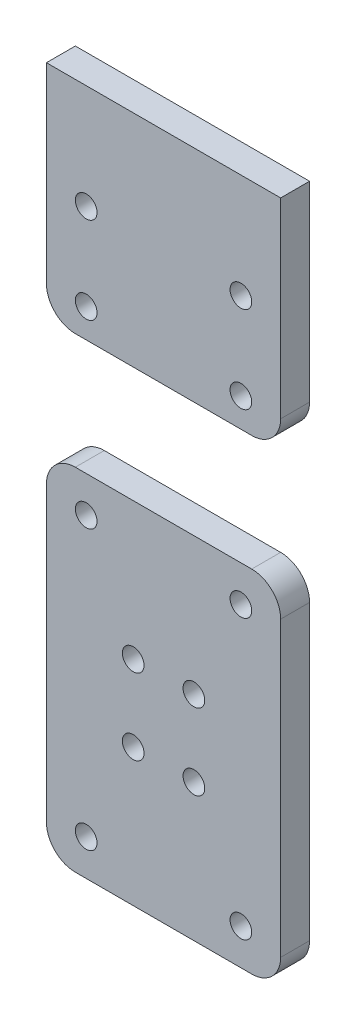
ISO-10303-21;
HEADER;
FILE_DESCRIPTION(('STEP AP214'),'2;1');
FILE_NAME('part.step','',(''),(''),'','','');
FILE_SCHEMA(('AUTOMOTIVE_DESIGN { 1 0 10303 214 1 1 1 1 }'));
ENDSEC;
DATA;
#1=APPLICATION_CONTEXT('core data for automotive mechanical design processes');
#2=APPLICATION_PROTOCOL_DEFINITION('international standard','automotive_design',2000,#1);
#3=PRODUCT_CONTEXT('',#1,'mechanical');
#4=PRODUCT('Part','Part','',(#3));
#5=PRODUCT_RELATED_PRODUCT_CATEGORY('part','',(#4));
#6=PRODUCT_DEFINITION_FORMATION('','',#4);
#7=PRODUCT_DEFINITION_CONTEXT('part definition',#1,'design');
#8=PRODUCT_DEFINITION('design','',#6,#7);
#9=PRODUCT_DEFINITION_SHAPE('','',#8);
#10=(LENGTH_UNIT() NAMED_UNIT(*) SI_UNIT(.MILLI.,.METRE.));
#11=(NAMED_UNIT(*) PLANE_ANGLE_UNIT() SI_UNIT($,.RADIAN.));
#12=(NAMED_UNIT(*) SI_UNIT($,.STERADIAN.) SOLID_ANGLE_UNIT());
#13=UNCERTAINTY_MEASURE_WITH_UNIT(LENGTH_MEASURE(1.E-05),#10,'distance_accuracy_value','');
#14=(GEOMETRIC_REPRESENTATION_CONTEXT(3) GLOBAL_UNCERTAINTY_ASSIGNED_CONTEXT((#13)) GLOBAL_UNIT_ASSIGNED_CONTEXT((#10,
#11,#12)) REPRESENTATION_CONTEXT('',''));
#15=CARTESIAN_POINT('',(0.,0.,0.));
#16=DIRECTION('',(0.,0.,1.));
#17=DIRECTION('',(1.,0.,0.));
#18=AXIS2_PLACEMENT_3D('',#15,#16,#17);
#19=CARTESIAN_POINT('',(2.00000000000013,54.7,2.));
#20=DIRECTION('',(0.,0.,1.));
#21=DIRECTION('',(1.,0.,0.));
#22=AXIS2_PLACEMENT_3D('',#19,#20,#21);
#23=PLANE('',#22);
#24=CARTESIAN_POINT('',(2.00000000000013,54.7,2.));
#25=DIRECTION('',(0.,0.,1.));
#26=DIRECTION('',(1.,0.,0.));
#27=AXIS2_PLACEMENT_3D('',#24,#25,#26);
#28=CIRCLE('',#27,2.00000000000002);
#29=CARTESIAN_POINT('',(1.11022302462516E-13,54.7,2.));
#30=VERTEX_POINT('',#29);
#31=CARTESIAN_POINT('',(2.00000000000013,52.7,2.));
#32=VERTEX_POINT('',#31);
#33=EDGE_CURVE('E100',#30,#32,#28,.T.);
#34=ORIENTED_EDGE('',*,*,#33,.T.);
#35=DIRECTION('',(1.,0.,0.));
#36=VECTOR('',#35,1.);
#37=CARTESIAN_POINT('',(14.1999999999999,52.7,2.));
#38=LINE('',#37,#36);
#39=CARTESIAN_POINT('',(14.1999999999999,52.7,2.));
#40=VERTEX_POINT('',#39);
#41=EDGE_CURVE('E96',#32,#40,#38,.T.);
#42=ORIENTED_EDGE('',*,*,#41,.T.);
#43=CARTESIAN_POINT('',(14.1999999999999,54.7,2.));
#44=DIRECTION('',(0.,0.,1.));
#45=DIRECTION('',(-1.,0.,0.));
#46=AXIS2_PLACEMENT_3D('',#43,#44,#45);
#47=CIRCLE('',#46,2.00000000000001);
#48=CARTESIAN_POINT('',(16.1999999999999,54.7,2.));
#49=VERTEX_POINT('',#48);
#50=EDGE_CURVE('E93',#40,#49,#47,.T.);
#51=ORIENTED_EDGE('',*,*,#50,.T.);
#52=DIRECTION('',(0.,1.,0.));
#53=VECTOR('',#52,1.);
#54=CARTESIAN_POINT('',(16.1999999999999,54.7,2.));
#55=LINE('',#54,#53);
#56=CARTESIAN_POINT('',(16.1999999999999,67.93,2.));
#57=VERTEX_POINT('',#56);
#58=EDGE_CURVE('E116',#49,#57,#55,.T.);
#59=ORIENTED_EDGE('',*,*,#58,.T.);
#60=DIRECTION('',(-1.,0.,0.));
#61=VECTOR('',#60,1.);
#62=CARTESIAN_POINT('',(1.03649727689614E-13,67.93,2.));
#63=LINE('',#62,#61);
#64=CARTESIAN_POINT('',(1.03649727689614E-13,67.93,2.));
#65=VERTEX_POINT('',#64);
#66=EDGE_CURVE('E118',#57,#65,#63,.T.);
#67=ORIENTED_EDGE('',*,*,#66,.T.);
#68=DIRECTION('',(0.,-1.,0.));
#69=VECTOR('',#68,1.);
#70=CARTESIAN_POINT('',(1.11022302462516E-13,54.7,2.));
#71=LINE('',#70,#69);
#72=EDGE_CURVE('E144',#65,#30,#71,.T.);
#73=ORIENTED_EDGE('',*,*,#72,.T.);
#74=EDGE_LOOP('',(#34,#42,#51,#59,#67,#73));
#75=FACE_BOUND('',#74,.T.);
#76=CARTESIAN_POINT('',(2.74999999998533,54.7,2.));
#77=DIRECTION('',(0.,0.,1.));
#78=DIRECTION('',(1.,0.,0.));
#79=AXIS2_PLACEMENT_3D('',#76,#77,#78);
#80=CIRCLE('',#79,0.749999999999999);
#81=CARTESIAN_POINT('',(3.49999999998533,54.7,2.));
#82=VERTEX_POINT('',#81);
#83=EDGE_CURVE('E12',#82,#82,#80,.T.);
#84=ORIENTED_EDGE('',*,*,#83,.F.);
#85=EDGE_LOOP('',(#84));
#86=FACE_BOUND('',#85,.T.);
#87=CARTESIAN_POINT('',(13.4500000000147,60.7,2.));
#88=DIRECTION('',(0.,0.,1.));
#89=DIRECTION('',(-1.,0.,0.));
#90=AXIS2_PLACEMENT_3D('',#87,#88,#89);
#91=CIRCLE('',#90,0.75);
#92=CARTESIAN_POINT('',(12.7000000000147,60.7,2.));
#93=VERTEX_POINT('',#92);
#94=EDGE_CURVE('E53',#93,#93,#91,.T.);
#95=ORIENTED_EDGE('',*,*,#94,.F.);
#96=EDGE_LOOP('',(#95));
#97=FACE_BOUND('',#96,.T.);
#98=CARTESIAN_POINT('',(13.4500000000147,54.7,2.));
#99=DIRECTION('',(0.,0.,1.));
#100=DIRECTION('',(-1.,0.,0.));
#101=AXIS2_PLACEMENT_3D('',#98,#99,#100);
#102=CIRCLE('',#101,0.749999999999999);
#103=CARTESIAN_POINT('',(12.7000000000147,54.7,2.));
#104=VERTEX_POINT('',#103);
#105=EDGE_CURVE('E129',#104,#104,#102,.T.);
#106=ORIENTED_EDGE('',*,*,#105,.F.);
#107=EDGE_LOOP('',(#106));
#108=FACE_BOUND('',#107,.T.);
#109=CARTESIAN_POINT('',(2.74999999998533,60.7,2.));
#110=DIRECTION('',(0.,0.,1.));
#111=DIRECTION('',(1.,0.,0.));
#112=AXIS2_PLACEMENT_3D('',#109,#110,#111);
#113=CIRCLE('',#112,0.750000000000001);
#114=CARTESIAN_POINT('',(3.49999999998533,60.7,2.));
#115=VERTEX_POINT('',#114);
#116=EDGE_CURVE('E126',#115,#115,#113,.T.);
#117=ORIENTED_EDGE('',*,*,#116,.F.);
#118=EDGE_LOOP('',(#117));
#119=FACE_BOUND('',#118,.T.);
#120=ADVANCED_FACE('F45',(#75,#86,#97,#108,#119),#23,.T.);
#121=CARTESIAN_POINT('',(2.00000000000013,54.7,0.));
#122=DIRECTION('',(0.,0.,1.));
#123=DIRECTION('',(1.,0.,0.));
#124=AXIS2_PLACEMENT_3D('',#121,#122,#123);
#125=PLANE('',#124);
#126=CARTESIAN_POINT('',(2.74999999998533,54.7,0.));
#127=DIRECTION('',(0.,0.,1.));
#128=DIRECTION('',(1.,0.,0.));
#129=AXIS2_PLACEMENT_3D('',#126,#127,#128);
#130=CIRCLE('',#129,0.749999999999999);
#131=CARTESIAN_POINT('',(3.49999999998533,54.7,0.));
#132=VERTEX_POINT('',#131);
#133=EDGE_CURVE('E139',#132,#132,#130,.T.);
#134=ORIENTED_EDGE('',*,*,#133,.T.);
#135=EDGE_LOOP('',(#134));
#136=FACE_BOUND('',#135,.T.);
#137=CARTESIAN_POINT('',(13.4500000000147,60.7,0.));
#138=DIRECTION('',(0.,0.,1.));
#139=DIRECTION('',(-1.,0.,0.));
#140=AXIS2_PLACEMENT_3D('',#137,#138,#139);
#141=CIRCLE('',#140,0.75);
#142=CARTESIAN_POINT('',(12.7000000000147,60.7,0.));
#143=VERTEX_POINT('',#142);
#144=EDGE_CURVE('E134',#143,#143,#141,.T.);
#145=ORIENTED_EDGE('',*,*,#144,.T.);
#146=EDGE_LOOP('',(#145));
#147=FACE_BOUND('',#146,.T.);
#148=CARTESIAN_POINT('',(13.4500000000147,54.7,0.));
#149=DIRECTION('',(0.,0.,1.));
#150=DIRECTION('',(-1.,0.,0.));
#151=AXIS2_PLACEMENT_3D('',#148,#149,#150);
#152=CIRCLE('',#151,0.749999999999999);
#153=CARTESIAN_POINT('',(12.7000000000147,54.7,0.));
#154=VERTEX_POINT('',#153);
#155=EDGE_CURVE('E125',#154,#154,#152,.T.);
#156=ORIENTED_EDGE('',*,*,#155,.T.);
#157=EDGE_LOOP('',(#156));
#158=FACE_BOUND('',#157,.T.);
#159=CARTESIAN_POINT('',(2.74999999998533,60.7,0.));
#160=DIRECTION('',(0.,0.,1.));
#161=DIRECTION('',(1.,0.,0.));
#162=AXIS2_PLACEMENT_3D('',#159,#160,#161);
#163=CIRCLE('',#162,0.750000000000001);
#164=CARTESIAN_POINT('',(3.49999999998533,60.7,0.));
#165=VERTEX_POINT('',#164);
#166=EDGE_CURVE('E122',#165,#165,#163,.T.);
#167=ORIENTED_EDGE('',*,*,#166,.T.);
#168=EDGE_LOOP('',(#167));
#169=FACE_BOUND('',#168,.T.);
#170=CARTESIAN_POINT('',(14.1999999999999,54.7,0.));
#171=DIRECTION('',(0.,0.,1.));
#172=DIRECTION('',(-1.,0.,0.));
#173=AXIS2_PLACEMENT_3D('',#170,#171,#172);
#174=CIRCLE('',#173,2.00000000000001);
#175=CARTESIAN_POINT('',(14.1999999999999,52.7,0.));
#176=VERTEX_POINT('',#175);
#177=CARTESIAN_POINT('',(16.1999999999999,54.7,0.));
#178=VERTEX_POINT('',#177);
#179=EDGE_CURVE('E110',#176,#178,#174,.T.);
#180=ORIENTED_EDGE('',*,*,#179,.F.);
#181=DIRECTION('',(-1.,0.,0.));
#182=VECTOR('',#181,1.);
#183=CARTESIAN_POINT('',(6.,52.7,0.));
#184=LINE('',#183,#182);
#185=CARTESIAN_POINT('',(2.00000000000013,52.7,0.));
#186=VERTEX_POINT('',#185);
#187=EDGE_CURVE('E61',#176,#186,#184,.T.);
#188=ORIENTED_EDGE('',*,*,#187,.T.);
#189=CARTESIAN_POINT('',(2.00000000000013,54.7,0.));
#190=DIRECTION('',(0.,0.,1.));
#191=DIRECTION('',(1.,0.,0.));
#192=AXIS2_PLACEMENT_3D('',#189,#190,#191);
#193=CIRCLE('',#192,2.00000000000002);
#194=CARTESIAN_POINT('',(1.11022302462516E-13,54.7,0.));
#195=VERTEX_POINT('',#194);
#196=EDGE_CURVE('E163',#195,#186,#193,.T.);
#197=ORIENTED_EDGE('',*,*,#196,.F.);
#198=DIRECTION('',(0.,-1.,0.));
#199=VECTOR('',#198,1.);
#200=CARTESIAN_POINT('',(1.11022302462516E-13,54.7,0.));
#201=LINE('',#200,#199);
#202=CARTESIAN_POINT('',(1.03649727689614E-13,67.93,0.));
#203=VERTEX_POINT('',#202);
#204=EDGE_CURVE('E164',#203,#195,#201,.T.);
#205=ORIENTED_EDGE('',*,*,#204,.F.);
#206=DIRECTION('',(-1.,0.,0.));
#207=VECTOR('',#206,1.);
#208=CARTESIAN_POINT('',(1.03649727689614E-13,67.93,0.));
#209=LINE('',#208,#207);
#210=CARTESIAN_POINT('',(16.1999999999999,67.93,0.));
#211=VERTEX_POINT('',#210);
#212=EDGE_CURVE('E160',#211,#203,#209,.T.);
#213=ORIENTED_EDGE('',*,*,#212,.F.);
#214=DIRECTION('',(0.,1.,0.));
#215=VECTOR('',#214,1.);
#216=CARTESIAN_POINT('',(16.1999999999999,54.7,0.));
#217=LINE('',#216,#215);
#218=EDGE_CURVE('E109',#178,#211,#217,.T.);
#219=ORIENTED_EDGE('',*,*,#218,.F.);
#220=EDGE_LOOP('',(#180,#188,#197,#205,#213,#219));
#221=FACE_BOUND('',#220,.T.);
#222=ADVANCED_FACE('F181',(#136,#147,#158,#169,#221),#125,.F.);
#223=CARTESIAN_POINT('',(14.1999999999999,52.7,2.));
#224=DIRECTION('',(0.,1.,0.));
#225=DIRECTION('',(0.,0.,1.));
#226=AXIS2_PLACEMENT_3D('',#223,#224,#225);
#227=PLANE('',#226);
#228=ORIENTED_EDGE('',*,*,#187,.F.);
#229=DIRECTION('',(0.,0.,-1.));
#230=VECTOR('',#229,1.);
#231=CARTESIAN_POINT('',(14.1999999999999,52.7,2.));
#232=LINE('',#231,#230);
#233=EDGE_CURVE('E106',#40,#176,#232,.T.);
#234=ORIENTED_EDGE('',*,*,#233,.F.);
#235=ORIENTED_EDGE('',*,*,#41,.F.);
#236=DIRECTION('',(0.,0.,-1.));
#237=VECTOR('',#236,1.);
#238=CARTESIAN_POINT('',(2.00000000000013,52.7,2.));
#239=LINE('',#238,#237);
#240=EDGE_CURVE('E130',#32,#186,#239,.T.);
#241=ORIENTED_EDGE('',*,*,#240,.T.);
#242=EDGE_LOOP('',(#228,#234,#235,#241));
#243=FACE_BOUND('',#242,.T.);
#244=ADVANCED_FACE('F107',(#243),#227,.F.);
#245=CARTESIAN_POINT('',(14.1999999999999,54.7,2.));
#246=DIRECTION('',(0.,0.,-1.));
#247=DIRECTION('',(-1.,0.,0.));
#248=AXIS2_PLACEMENT_3D('',#245,#246,#247);
#249=CYLINDRICAL_SURFACE('',#248,2.00000000000001);
#250=ORIENTED_EDGE('',*,*,#179,.T.);
#251=DIRECTION('',(0.,0.,-1.));
#252=VECTOR('',#251,1.);
#253=CARTESIAN_POINT('',(16.1999999999999,54.7,2.));
#254=LINE('',#253,#252);
#255=EDGE_CURVE('E114',#49,#178,#254,.T.);
#256=ORIENTED_EDGE('',*,*,#255,.F.);
#257=ORIENTED_EDGE('',*,*,#50,.F.);
#258=ORIENTED_EDGE('',*,*,#233,.T.);
#259=EDGE_LOOP('',(#250,#256,#257,#258));
#260=FACE_BOUND('',#259,.T.);
#261=ADVANCED_FACE('F112',(#260),#249,.T.);
#262=CARTESIAN_POINT('',(16.1999999999999,54.7,2.));
#263=DIRECTION('',(-1.,0.,0.));
#264=DIRECTION('',(0.,0.,1.));
#265=AXIS2_PLACEMENT_3D('',#262,#263,#264);
#266=PLANE('',#265);
#267=ORIENTED_EDGE('',*,*,#218,.T.);
#268=DIRECTION('',(0.,0.,-1.));
#269=VECTOR('',#268,1.);
#270=CARTESIAN_POINT('',(16.1999999999999,67.93,2.));
#271=LINE('',#270,#269);
#272=EDGE_CURVE('E176',#57,#211,#271,.T.);
#273=ORIENTED_EDGE('',*,*,#272,.F.);
#274=ORIENTED_EDGE('',*,*,#58,.F.);
#275=ORIENTED_EDGE('',*,*,#255,.T.);
#276=EDGE_LOOP('',(#267,#273,#274,#275));
#277=FACE_BOUND('',#276,.T.);
#278=ADVANCED_FACE('F212',(#277),#266,.F.);
#279=CARTESIAN_POINT('',(1.03649727689614E-13,67.93,2.));
#280=DIRECTION('',(0.,-1.,0.));
#281=DIRECTION('',(0.,0.,-1.));
#282=AXIS2_PLACEMENT_3D('',#279,#280,#281);
#283=PLANE('',#282);
#284=ORIENTED_EDGE('',*,*,#212,.T.);
#285=DIRECTION('',(0.,0.,-1.));
#286=VECTOR('',#285,1.);
#287=CARTESIAN_POINT('',(1.03649727689614E-13,67.93,2.));
#288=LINE('',#287,#286);
#289=EDGE_CURVE('E157',#65,#203,#288,.T.);
#290=ORIENTED_EDGE('',*,*,#289,.F.);
#291=ORIENTED_EDGE('',*,*,#66,.F.);
#292=ORIENTED_EDGE('',*,*,#272,.T.);
#293=EDGE_LOOP('',(#284,#290,#291,#292));
#294=FACE_BOUND('',#293,.T.);
#295=ADVANCED_FACE('F158',(#294),#283,.F.);
#296=CARTESIAN_POINT('',(1.11022302462516E-13,54.7,2.));
#297=DIRECTION('',(1.,0.,0.));
#298=DIRECTION('',(0.,1.,0.));
#299=AXIS2_PLACEMENT_3D('',#296,#297,#298);
#300=PLANE('',#299);
#301=ORIENTED_EDGE('',*,*,#204,.T.);
#302=DIRECTION('',(0.,0.,-1.));
#303=VECTOR('',#302,1.);
#304=CARTESIAN_POINT('',(1.11022302462516E-13,54.7,2.));
#305=LINE('',#304,#303);
#306=EDGE_CURVE('E168',#30,#195,#305,.T.);
#307=ORIENTED_EDGE('',*,*,#306,.F.);
#308=ORIENTED_EDGE('',*,*,#72,.F.);
#309=ORIENTED_EDGE('',*,*,#289,.T.);
#310=EDGE_LOOP('',(#301,#307,#308,#309));
#311=FACE_BOUND('',#310,.T.);
#312=ADVANCED_FACE('F166',(#311),#300,.F.);
#313=CARTESIAN_POINT('',(2.00000000000013,54.7,2.));
#314=DIRECTION('',(0.,0.,-1.));
#315=DIRECTION('',(-1.,0.,0.));
#316=AXIS2_PLACEMENT_3D('',#313,#314,#315);
#317=CYLINDRICAL_SURFACE('',#316,2.00000000000002);
#318=ORIENTED_EDGE('',*,*,#196,.T.);
#319=ORIENTED_EDGE('',*,*,#240,.F.);
#320=ORIENTED_EDGE('',*,*,#33,.F.);
#321=ORIENTED_EDGE('',*,*,#306,.T.);
#322=EDGE_LOOP('',(#318,#319,#320,#321));
#323=FACE_BOUND('',#322,.T.);
#324=ADVANCED_FACE('F171',(#323),#317,.T.);
#325=CARTESIAN_POINT('',(2.74999999998533,60.7,2.));
#326=DIRECTION('',(0.,0.,-1.));
#327=DIRECTION('',(-1.,0.,0.));
#328=AXIS2_PLACEMENT_3D('',#325,#326,#327);
#329=CYLINDRICAL_SURFACE('',#328,0.750000000000001);
#330=ORIENTED_EDGE('',*,*,#116,.T.);
#331=EDGE_LOOP('',(#330));
#332=FACE_BOUND('',#331,.T.);
#333=ORIENTED_EDGE('',*,*,#166,.F.);
#334=EDGE_LOOP('',(#333));
#335=FACE_BOUND('',#334,.T.);
#336=ADVANCED_FACE('F201',(#332,#335),#329,.F.);
#337=CARTESIAN_POINT('',(13.4500000000147,54.7,2.));
#338=DIRECTION('',(0.,0.,-1.));
#339=DIRECTION('',(-1.,0.,0.));
#340=AXIS2_PLACEMENT_3D('',#337,#338,#339);
#341=CYLINDRICAL_SURFACE('',#340,0.749999999999999);
#342=ORIENTED_EDGE('',*,*,#105,.T.);
#343=EDGE_LOOP('',(#342));
#344=FACE_BOUND('',#343,.T.);
#345=ORIENTED_EDGE('',*,*,#155,.F.);
#346=EDGE_LOOP('',(#345));
#347=FACE_BOUND('',#346,.T.);
#348=ADVANCED_FACE('F197',(#344,#347),#341,.F.);
#349=CARTESIAN_POINT('',(13.4500000000147,60.7,2.));
#350=DIRECTION('',(0.,0.,-1.));
#351=DIRECTION('',(-1.,0.,0.));
#352=AXIS2_PLACEMENT_3D('',#349,#350,#351);
#353=CYLINDRICAL_SURFACE('',#352,0.75);
#354=ORIENTED_EDGE('',*,*,#94,.T.);
#355=EDGE_LOOP('',(#354));
#356=FACE_BOUND('',#355,.T.);
#357=ORIENTED_EDGE('',*,*,#144,.F.);
#358=EDGE_LOOP('',(#357));
#359=FACE_BOUND('',#358,.T.);
#360=ADVANCED_FACE('F193',(#356,#359),#353,.F.);
#361=CARTESIAN_POINT('',(2.74999999998533,54.7,2.));
#362=DIRECTION('',(0.,0.,-1.));
#363=DIRECTION('',(-1.,0.,0.));
#364=AXIS2_PLACEMENT_3D('',#361,#362,#363);
#365=CYLINDRICAL_SURFACE('',#364,0.749999999999999);
#366=ORIENTED_EDGE('',*,*,#83,.T.);
#367=EDGE_LOOP('',(#366));
#368=FACE_BOUND('',#367,.T.);
#369=ORIENTED_EDGE('',*,*,#133,.F.);
#370=EDGE_LOOP('',(#369));
#371=FACE_BOUND('',#370,.T.);
#372=ADVANCED_FACE('F190',(#368,#371),#365,.F.);
#373=CLOSED_SHELL('',(#120,#222,#244,#261,#278,#295,#312,#324,#336,#348,#360,#372));
#374=MANIFOLD_SOLID_BREP('B2',#373);
#375=CARTESIAN_POINT('',(2.74999999998475,22.9400000000004,2.));
#376=DIRECTION('',(0.,0.,-1.));
#377=DIRECTION('',(-1.,0.,0.));
#378=AXIS2_PLACEMENT_3D('',#375,#376,#377);
#379=CYLINDRICAL_SURFACE('',#378,0.750000000000001);
#380=CARTESIAN_POINT('',(2.74999999998475,22.9400000000004,2.));
#381=DIRECTION('',(0.,0.,1.));
#382=DIRECTION('',(1.,0.,0.));
#383=AXIS2_PLACEMENT_3D('',#380,#381,#382);
#384=CIRCLE('',#383,0.750000000000001);
#385=CARTESIAN_POINT('',(3.49999999998475,22.9400000000004,2.));
#386=VERTEX_POINT('',#385);
#387=EDGE_CURVE('E503',#386,#386,#384,.T.);
#388=ORIENTED_EDGE('',*,*,#387,.T.);
#389=EDGE_LOOP('',(#388));
#390=FACE_BOUND('',#389,.T.);
#391=CARTESIAN_POINT('',(2.74999999998475,22.9400000000004,0.));
#392=DIRECTION('',(0.,0.,1.));
#393=DIRECTION('',(1.,0.,0.));
#394=AXIS2_PLACEMENT_3D('',#391,#392,#393);
#395=CIRCLE('',#394,0.750000000000001);
#396=CARTESIAN_POINT('',(3.49999999998475,22.9400000000004,0.));
#397=VERTEX_POINT('',#396);
#398=EDGE_CURVE('E506',#397,#397,#395,.T.);
#399=ORIENTED_EDGE('',*,*,#398,.F.);
#400=EDGE_LOOP('',(#399));
#401=FACE_BOUND('',#400,.T.);
#402=ADVANCED_FACE('F320',(#390,#401),#379,.F.);
#403=CARTESIAN_POINT('',(10.2,35.2,2.));
#404=DIRECTION('',(0.,0.,-1.));
#405=DIRECTION('',(-1.,0.,0.));
#406=AXIS2_PLACEMENT_3D('',#403,#404,#405);
#407=CYLINDRICAL_SURFACE('',#406,0.749999999999999);
#408=CARTESIAN_POINT('',(10.2,35.2,2.));
#409=DIRECTION('',(0.,0.,1.));
#410=DIRECTION('',(-1.,0.,0.));
#411=AXIS2_PLACEMENT_3D('',#408,#409,#410);
#412=CIRCLE('',#411,0.749999999999999);
#413=CARTESIAN_POINT('',(9.44999999999999,35.2,2.));
#414=VERTEX_POINT('',#413);
#415=EDGE_CURVE('E491',#414,#414,#412,.T.);
#416=ORIENTED_EDGE('',*,*,#415,.T.);
#417=EDGE_LOOP('',(#416));
#418=FACE_BOUND('',#417,.T.);
#419=CARTESIAN_POINT('',(10.2,35.2,0.));
#420=DIRECTION('',(0.,0.,1.));
#421=DIRECTION('',(-1.,0.,0.));
#422=AXIS2_PLACEMENT_3D('',#419,#420,#421);
#423=CIRCLE('',#422,0.749999999999999);
#424=CARTESIAN_POINT('',(9.44999999999999,35.2,0.));
#425=VERTEX_POINT('',#424);
#426=EDGE_CURVE('E494',#425,#425,#423,.T.);
#427=ORIENTED_EDGE('',*,*,#426,.F.);
#428=EDGE_LOOP('',(#427));
#429=FACE_BOUND('',#428,.T.);
#430=ADVANCED_FACE('F539',(#418,#429),#407,.F.);
#431=CARTESIAN_POINT('',(13.4500000000152,22.9400000000004,2.));
#432=DIRECTION('',(0.,0.,-1.));
#433=DIRECTION('',(-1.,0.,0.));
#434=AXIS2_PLACEMENT_3D('',#431,#432,#433);
#435=CYLINDRICAL_SURFACE('',#434,0.749999999999999);
#436=CARTESIAN_POINT('',(13.4500000000152,22.9400000000004,2.));
#437=DIRECTION('',(0.,0.,1.));
#438=DIRECTION('',(-1.,0.,0.));
#439=AXIS2_PLACEMENT_3D('',#436,#437,#438);
#440=CIRCLE('',#439,0.749999999999999);
#441=CARTESIAN_POINT('',(12.7000000000152,22.9400000000004,2.));
#442=VERTEX_POINT('',#441);
#443=EDGE_CURVE('E473',#442,#442,#440,.T.);
#444=ORIENTED_EDGE('',*,*,#443,.T.);
#445=EDGE_LOOP('',(#444));
#446=FACE_BOUND('',#445,.T.);
#447=CARTESIAN_POINT('',(13.4500000000152,22.9400000000004,0.));
#448=DIRECTION('',(0.,0.,1.));
#449=DIRECTION('',(-1.,0.,0.));
#450=AXIS2_PLACEMENT_3D('',#447,#448,#449);
#451=CIRCLE('',#450,0.749999999999999);
#452=CARTESIAN_POINT('',(12.7000000000152,22.9400000000004,0.));
#453=VERTEX_POINT('',#452);
#454=EDGE_CURVE('E476',#453,#453,#451,.T.);
#455=ORIENTED_EDGE('',*,*,#454,.F.);
#456=EDGE_LOOP('',(#455));
#457=FACE_BOUND('',#456,.T.);
#458=ADVANCED_FACE('F566',(#446,#457),#435,.F.);
#459=CARTESIAN_POINT('',(0.,22.44,2.));
#460=DIRECTION('',(1.,0.,0.));
#461=DIRECTION('',(0.,0.,-1.));
#462=AXIS2_PLACEMENT_3D('',#459,#460,#461);
#463=PLANE('',#462);
#464=DIRECTION('',(0.,-1.,0.));
#465=VECTOR('',#464,1.);
#466=CARTESIAN_POINT('',(0.,22.44,0.));
#467=LINE('',#466,#465);
#468=CARTESIAN_POINT('',(0.,42.7,0.));
#469=VERTEX_POINT('',#468);
#470=CARTESIAN_POINT('',(0.,22.44,0.));
#471=VERTEX_POINT('',#470);
#472=EDGE_CURVE('E424',#469,#471,#467,.T.);
#473=ORIENTED_EDGE('',*,*,#472,.T.);
#474=DIRECTION('',(0.,0.,-1.));
#475=VECTOR('',#474,1.);
#476=CARTESIAN_POINT('',(0.,22.44,2.));
#477=LINE('',#476,#475);
#478=CARTESIAN_POINT('',(0.,22.44,2.));
#479=VERTEX_POINT('',#478);
#480=EDGE_CURVE('E443',#479,#471,#477,.T.);
#481=ORIENTED_EDGE('',*,*,#480,.F.);
#482=DIRECTION('',(0.,-1.,0.));
#483=VECTOR('',#482,1.);
#484=CARTESIAN_POINT('',(0.,22.44,2.));
#485=LINE('',#484,#483);
#486=CARTESIAN_POINT('',(0.,42.7,2.));
#487=VERTEX_POINT('',#486);
#488=EDGE_CURVE('E451',#487,#479,#485,.T.);
#489=ORIENTED_EDGE('',*,*,#488,.F.);
#490=DIRECTION('',(0.,0.,-1.));
#491=VECTOR('',#490,1.);
#492=CARTESIAN_POINT('',(0.,42.7,2.));
#493=LINE('',#492,#491);
#494=EDGE_CURVE('E329',#487,#469,#493,.T.);
#495=ORIENTED_EDGE('',*,*,#494,.T.);
#496=EDGE_LOOP('',(#473,#481,#489,#495));
#497=FACE_BOUND('',#496,.T.);
#498=ADVANCED_FACE('F449',(#497),#463,.F.);
#499=CARTESIAN_POINT('',(2.,22.44,2.));
#500=DIRECTION('',(0.,0.,-1.));
#501=DIRECTION('',(-1.,0.,0.));
#502=AXIS2_PLACEMENT_3D('',#499,#500,#501);
#503=CYLINDRICAL_SURFACE('',#502,2.);
#504=CARTESIAN_POINT('',(2.,22.44,0.));
#505=DIRECTION('',(0.,0.,1.));
#506=DIRECTION('',(1.,0.,0.));
#507=AXIS2_PLACEMENT_3D('',#504,#505,#506);
#508=CIRCLE('',#507,2.);
#509=CARTESIAN_POINT('',(2.,20.44,0.));
#510=VERTEX_POINT('',#509);
#511=EDGE_CURVE('E427',#471,#510,#508,.T.);
#512=ORIENTED_EDGE('',*,*,#511,.T.);
#513=DIRECTION('',(0.,0.,-1.));
#514=VECTOR('',#513,1.);
#515=CARTESIAN_POINT('',(2.,20.44,2.));
#516=LINE('',#515,#514);
#517=CARTESIAN_POINT('',(2.,20.44,2.));
#518=VERTEX_POINT('',#517);
#519=EDGE_CURVE('E440',#518,#510,#516,.T.);
#520=ORIENTED_EDGE('',*,*,#519,.F.);
#521=CARTESIAN_POINT('',(2.,22.44,2.));
#522=DIRECTION('',(0.,0.,1.));
#523=DIRECTION('',(1.,0.,0.));
#524=AXIS2_PLACEMENT_3D('',#521,#522,#523);
#525=CIRCLE('',#524,2.);
#526=EDGE_CURVE('E464',#479,#518,#525,.T.);
#527=ORIENTED_EDGE('',*,*,#526,.F.);
#528=ORIENTED_EDGE('',*,*,#480,.T.);
#529=EDGE_LOOP('',(#512,#520,#527,#528));
#530=FACE_BOUND('',#529,.T.);
#531=ADVANCED_FACE('F460',(#530),#503,.T.);
#532=CARTESIAN_POINT('',(14.2,20.44,2.));
#533=DIRECTION('',(0.,1.,0.));
#534=DIRECTION('',(0.,0.,1.));
#535=AXIS2_PLACEMENT_3D('',#532,#533,#534);
#536=PLANE('',#535);
#537=DIRECTION('',(1.,0.,0.));
#538=VECTOR('',#537,1.);
#539=CARTESIAN_POINT('',(14.2,20.44,0.));
#540=LINE('',#539,#538);
#541=CARTESIAN_POINT('',(14.2,20.44,0.));
#542=VERTEX_POINT('',#541);
#543=EDGE_CURVE('E430',#510,#542,#540,.T.);
#544=ORIENTED_EDGE('',*,*,#543,.T.);
#545=DIRECTION('',(0.,0.,-1.));
#546=VECTOR('',#545,1.);
#547=CARTESIAN_POINT('',(14.2,20.44,2.));
#548=LINE('',#547,#546);
#549=CARTESIAN_POINT('',(14.2,20.44,2.));
#550=VERTEX_POINT('',#549);
#551=EDGE_CURVE('E411',#550,#542,#548,.T.);
#552=ORIENTED_EDGE('',*,*,#551,.F.);
#553=DIRECTION('',(1.,0.,0.));
#554=VECTOR('',#553,1.);
#555=CARTESIAN_POINT('',(2.,20.44,2.));
#556=LINE('',#555,#554);
#557=EDGE_CURVE('E402',#518,#550,#556,.T.);
#558=ORIENTED_EDGE('',*,*,#557,.F.);
#559=ORIENTED_EDGE('',*,*,#519,.T.);
#560=EDGE_LOOP('',(#544,#552,#558,#559));
#561=FACE_BOUND('',#560,.T.);
#562=ADVANCED_FACE('F463',(#561),#536,.F.);
#563=CARTESIAN_POINT('',(14.2,22.44,2.));
#564=DIRECTION('',(0.,0.,-1.));
#565=DIRECTION('',(-1.,0.,0.));
#566=AXIS2_PLACEMENT_3D('',#563,#564,#565);
#567=CYLINDRICAL_SURFACE('',#566,2.);
#568=CARTESIAN_POINT('',(14.2,22.44,0.));
#569=DIRECTION('',(0.,0.,1.));
#570=DIRECTION('',(-1.,0.,0.));
#571=AXIS2_PLACEMENT_3D('',#568,#569,#570);
#572=CIRCLE('',#571,2.);
#573=CARTESIAN_POINT('',(16.2,22.44,0.));
#574=VERTEX_POINT('',#573);
#575=EDGE_CURVE('E410',#542,#574,#572,.T.);
#576=ORIENTED_EDGE('',*,*,#575,.T.);
#577=DIRECTION('',(0.,0.,-1.));
#578=VECTOR('',#577,1.);
#579=CARTESIAN_POINT('',(16.2,22.44,2.));
#580=LINE('',#579,#578);
#581=CARTESIAN_POINT('',(16.2,22.44,2.));
#582=VERTEX_POINT('',#581);
#583=EDGE_CURVE('E407',#582,#574,#580,.T.);
#584=ORIENTED_EDGE('',*,*,#583,.F.);
#585=CARTESIAN_POINT('',(14.2,22.44,2.));
#586=DIRECTION('',(0.,0.,1.));
#587=DIRECTION('',(-1.,0.,0.));
#588=AXIS2_PLACEMENT_3D('',#585,#586,#587);
#589=CIRCLE('',#588,2.);
#590=EDGE_CURVE('E395',#550,#582,#589,.T.);
#591=ORIENTED_EDGE('',*,*,#590,.F.);
#592=ORIENTED_EDGE('',*,*,#551,.T.);
#593=EDGE_LOOP('',(#576,#584,#591,#592));
#594=FACE_BOUND('',#593,.T.);
#595=ADVANCED_FACE('F408',(#594),#567,.T.);
#596=CARTESIAN_POINT('',(16.2,22.44,2.));
#597=DIRECTION('',(-1.,0.,0.));
#598=DIRECTION('',(0.,0.,1.));
#599=AXIS2_PLACEMENT_3D('',#596,#597,#598);
#600=PLANE('',#599);
#601=DIRECTION('',(0.,1.,0.));
#602=VECTOR('',#601,1.);
#603=CARTESIAN_POINT('',(16.2,22.44,0.));
#604=LINE('',#603,#602);
#605=CARTESIAN_POINT('',(16.2,42.7,0.));
#606=VERTEX_POINT('',#605);
#607=EDGE_CURVE('E367',#574,#606,#604,.T.);
#608=ORIENTED_EDGE('',*,*,#607,.T.);
#609=DIRECTION('',(0.,0.,-1.));
#610=VECTOR('',#609,1.);
#611=CARTESIAN_POINT('',(16.2,42.7,2.));
#612=LINE('',#611,#610);
#613=CARTESIAN_POINT('',(16.2,42.7,2.));
#614=VERTEX_POINT('',#613);
#615=EDGE_CURVE('E412',#614,#606,#612,.T.);
#616=ORIENTED_EDGE('',*,*,#615,.F.);
#617=DIRECTION('',(0.,1.,0.));
#618=VECTOR('',#617,1.);
#619=CARTESIAN_POINT('',(16.2,22.44,2.));
#620=LINE('',#619,#618);
#621=EDGE_CURVE('E400',#582,#614,#620,.T.);
#622=ORIENTED_EDGE('',*,*,#621,.F.);
#623=ORIENTED_EDGE('',*,*,#583,.T.);
#624=EDGE_LOOP('',(#608,#616,#622,#623));
#625=FACE_BOUND('',#624,.T.);
#626=ADVANCED_FACE('F414',(#625),#600,.F.);
#627=CARTESIAN_POINT('',(13.4500000000152,42.2,2.));
#628=DIRECTION('',(0.,0.,-1.));
#629=DIRECTION('',(-1.,0.,0.));
#630=AXIS2_PLACEMENT_3D('',#627,#628,#629);
#631=CYLINDRICAL_SURFACE('',#630,0.749999999999999);
#632=CARTESIAN_POINT('',(13.4500000000152,42.2,2.));
#633=DIRECTION('',(0.,0.,1.));
#634=DIRECTION('',(-1.,0.,0.));
#635=AXIS2_PLACEMENT_3D('',#632,#633,#634);
#636=CIRCLE('',#635,0.749999999999999);
#637=CARTESIAN_POINT('',(12.7000000000152,42.2,2.));
#638=VERTEX_POINT('',#637);
#639=EDGE_CURVE('E425',#638,#638,#636,.T.);
#640=ORIENTED_EDGE('',*,*,#639,.T.);
#641=EDGE_LOOP('',(#640));
#642=FACE_BOUND('',#641,.T.);
#643=CARTESIAN_POINT('',(13.4500000000152,42.2,0.));
#644=DIRECTION('',(0.,0.,1.));
#645=DIRECTION('',(-1.,0.,0.));
#646=AXIS2_PLACEMENT_3D('',#643,#644,#645);
#647=CIRCLE('',#646,0.749999999999999);
#648=CARTESIAN_POINT('',(12.7000000000152,42.2,0.));
#649=VERTEX_POINT('',#648);
#650=EDGE_CURVE('E470',#649,#649,#647,.T.);
#651=ORIENTED_EDGE('',*,*,#650,.F.);
#652=EDGE_LOOP('',(#651));
#653=FACE_BOUND('',#652,.T.);
#654=ADVANCED_FACE('F559',(#642,#653),#631,.F.);
#655=CARTESIAN_POINT('',(10.2000000000153,29.9399999999999,2.));
#656=DIRECTION('',(0.,0.,-1.));
#657=DIRECTION('',(-1.,0.,0.));
#658=AXIS2_PLACEMENT_3D('',#655,#656,#657);
#659=CYLINDRICAL_SURFACE('',#658,0.749999999999999);
#660=CARTESIAN_POINT('',(10.2000000000153,29.9399999999999,2.));
#661=DIRECTION('',(0.,0.,1.));
#662=DIRECTION('',(-1.,0.,0.));
#663=AXIS2_PLACEMENT_3D('',#660,#661,#662);
#664=CIRCLE('',#663,0.749999999999999);
#665=CARTESIAN_POINT('',(9.45000000001527,29.9399999999999,2.));
#666=VERTEX_POINT('',#665);
#667=EDGE_CURVE('E479',#666,#666,#664,.T.);
#668=ORIENTED_EDGE('',*,*,#667,.T.);
#669=EDGE_LOOP('',(#668));
#670=FACE_BOUND('',#669,.T.);
#671=CARTESIAN_POINT('',(10.2000000000153,29.9399999999999,0.));
#672=DIRECTION('',(0.,0.,1.));
#673=DIRECTION('',(-1.,0.,0.));
#674=AXIS2_PLACEMENT_3D('',#671,#672,#673);
#675=CIRCLE('',#674,0.749999999999999);
#676=CARTESIAN_POINT('',(9.45000000001527,29.9399999999999,0.));
#677=VERTEX_POINT('',#676);
#678=EDGE_CURVE('E482',#677,#677,#675,.T.);
#679=ORIENTED_EDGE('',*,*,#678,.F.);
#680=EDGE_LOOP('',(#679));
#681=FACE_BOUND('',#680,.T.);
#682=ADVANCED_FACE('F579',(#670,#681),#659,.F.);
#683=CARTESIAN_POINT('',(6.,35.2,2.));
#684=DIRECTION('',(0.,0.,-1.));
#685=DIRECTION('',(-1.,0.,0.));
#686=AXIS2_PLACEMENT_3D('',#683,#684,#685);
#687=CYLINDRICAL_SURFACE('',#686,0.749999999999999);
#688=CARTESIAN_POINT('',(6.,35.2,2.));
#689=DIRECTION('',(0.,0.,1.));
#690=DIRECTION('',(1.,0.,0.));
#691=AXIS2_PLACEMENT_3D('',#688,#689,#690);
#692=CIRCLE('',#691,0.749999999999999);
#693=CARTESIAN_POINT('',(6.75,35.2,2.));
#694=VERTEX_POINT('',#693);
#695=EDGE_CURVE('E485',#694,#694,#692,.T.);
#696=ORIENTED_EDGE('',*,*,#695,.T.);
#697=EDGE_LOOP('',(#696));
#698=FACE_BOUND('',#697,.T.);
#699=CARTESIAN_POINT('',(6.,35.2,0.));
#700=DIRECTION('',(0.,0.,1.));
#701=DIRECTION('',(1.,0.,0.));
#702=AXIS2_PLACEMENT_3D('',#699,#700,#701);
#703=CIRCLE('',#702,0.749999999999999);
#704=CARTESIAN_POINT('',(6.75,35.2,0.));
#705=VERTEX_POINT('',#704);
#706=EDGE_CURVE('E488',#705,#705,#703,.T.);
#707=ORIENTED_EDGE('',*,*,#706,.F.);
#708=EDGE_LOOP('',(#707));
#709=FACE_BOUND('',#708,.T.);
#710=ADVANCED_FACE('F586',(#698,#709),#687,.F.);
#711=CARTESIAN_POINT('',(5.99999999998472,29.9399999999999,2.));
#712=DIRECTION('',(0.,0.,-1.));
#713=DIRECTION('',(-1.,0.,0.));
#714=AXIS2_PLACEMENT_3D('',#711,#712,#713);
#715=CYLINDRICAL_SURFACE('',#714,0.750000000000001);
#716=CARTESIAN_POINT('',(5.99999999998472,29.9399999999999,2.));
#717=DIRECTION('',(0.,0.,1.));
#718=DIRECTION('',(1.,0.,0.));
#719=AXIS2_PLACEMENT_3D('',#716,#717,#718);
#720=CIRCLE('',#719,0.750000000000001);
#721=CARTESIAN_POINT('',(6.74999999998473,29.9399999999999,2.));
#722=VERTEX_POINT('',#721);
#723=EDGE_CURVE('E497',#722,#722,#720,.T.);
#724=ORIENTED_EDGE('',*,*,#723,.T.);
#725=EDGE_LOOP('',(#724));
#726=FACE_BOUND('',#725,.T.);
#727=CARTESIAN_POINT('',(5.99999999998472,29.9399999999999,0.));
#728=DIRECTION('',(0.,0.,1.));
#729=DIRECTION('',(1.,0.,0.));
#730=AXIS2_PLACEMENT_3D('',#727,#728,#729);
#731=CIRCLE('',#730,0.750000000000001);
#732=CARTESIAN_POINT('',(6.74999999998473,29.9399999999999,0.));
#733=VERTEX_POINT('',#732);
#734=EDGE_CURVE('E500',#733,#733,#731,.T.);
#735=ORIENTED_EDGE('',*,*,#734,.F.);
#736=EDGE_LOOP('',(#735));
#737=FACE_BOUND('',#736,.T.);
#738=ADVANCED_FACE('F594',(#726,#737),#715,.F.);
#739=CARTESIAN_POINT('',(2.74999999998476,42.2,2.));
#740=DIRECTION('',(0.,0.,-1.));
#741=DIRECTION('',(-1.,0.,0.));
#742=AXIS2_PLACEMENT_3D('',#739,#740,#741);
#743=CYLINDRICAL_SURFACE('',#742,0.749999999999999);
#744=CARTESIAN_POINT('',(2.74999999998476,42.2,2.));
#745=DIRECTION('',(0.,0.,1.));
#746=DIRECTION('',(1.,0.,0.));
#747=AXIS2_PLACEMENT_3D('',#744,#745,#746);
#748=CIRCLE('',#747,0.749999999999999);
#749=CARTESIAN_POINT('',(3.49999999998476,42.2,2.));
#750=VERTEX_POINT('',#749);
#751=EDGE_CURVE('E509',#750,#750,#748,.T.);
#752=ORIENTED_EDGE('',*,*,#751,.T.);
#753=EDGE_LOOP('',(#752));
#754=FACE_BOUND('',#753,.T.);
#755=CARTESIAN_POINT('',(2.74999999998476,42.2,0.));
#756=DIRECTION('',(0.,0.,1.));
#757=DIRECTION('',(1.,0.,0.));
#758=AXIS2_PLACEMENT_3D('',#755,#756,#757);
#759=CIRCLE('',#758,0.749999999999999);
#760=CARTESIAN_POINT('',(3.49999999998476,42.2,0.));
#761=VERTEX_POINT('',#760);
#762=EDGE_CURVE('E512',#761,#761,#759,.T.);
#763=ORIENTED_EDGE('',*,*,#762,.F.);
#764=EDGE_LOOP('',(#763));
#765=FACE_BOUND('',#764,.T.);
#766=ADVANCED_FACE('F518',(#754,#765),#743,.F.);
#767=CARTESIAN_POINT('',(14.2,42.7,2.));
#768=DIRECTION('',(0.,0.,-1.));
#769=DIRECTION('',(-1.,0.,0.));
#770=AXIS2_PLACEMENT_3D('',#767,#768,#769);
#771=CYLINDRICAL_SURFACE('',#770,2.);
#772=CARTESIAN_POINT('',(14.2,42.7,0.));
#773=DIRECTION('',(0.,0.,1.));
#774=DIRECTION('',(-1.,0.,0.));
#775=AXIS2_PLACEMENT_3D('',#772,#773,#774);
#776=CIRCLE('',#775,2.);
#777=CARTESIAN_POINT('',(14.2,44.7,0.));
#778=VERTEX_POINT('',#777);
#779=EDGE_CURVE('E374',#606,#778,#776,.T.);
#780=ORIENTED_EDGE('',*,*,#779,.T.);
#781=DIRECTION('',(0.,0.,-1.));
#782=VECTOR('',#781,1.);
#783=CARTESIAN_POINT('',(14.2,44.7,2.));
#784=LINE('',#783,#782);
#785=CARTESIAN_POINT('',(14.2,44.7,2.));
#786=VERTEX_POINT('',#785);
#787=EDGE_CURVE('E418',#786,#778,#784,.T.);
#788=ORIENTED_EDGE('',*,*,#787,.F.);
#789=CARTESIAN_POINT('',(14.2,42.7,2.));
#790=DIRECTION('',(0.,0.,1.));
#791=DIRECTION('',(-1.,0.,0.));
#792=AXIS2_PLACEMENT_3D('',#789,#790,#791);
#793=CIRCLE('',#792,2.);
#794=EDGE_CURVE('E416',#614,#786,#793,.T.);
#795=ORIENTED_EDGE('',*,*,#794,.F.);
#796=ORIENTED_EDGE('',*,*,#615,.T.);
#797=EDGE_LOOP('',(#780,#788,#795,#796));
#798=FACE_BOUND('',#797,.T.);
#799=ADVANCED_FACE('F554',(#798),#771,.T.);
#800=CARTESIAN_POINT('',(1.99999999999999,42.7,2.));
#801=DIRECTION('',(0.,0.,-1.));
#802=DIRECTION('',(-1.,0.,0.));
#803=AXIS2_PLACEMENT_3D('',#800,#801,#802);
#804=CYLINDRICAL_SURFACE('',#803,2.);
#805=CARTESIAN_POINT('',(1.99999999999999,42.7,0.));
#806=DIRECTION('',(0.,0.,1.));
#807=DIRECTION('',(1.,0.,0.));
#808=AXIS2_PLACEMENT_3D('',#805,#806,#807);
#809=CIRCLE('',#808,2.);
#810=CARTESIAN_POINT('',(1.99999999999999,44.7,0.));
#811=VERTEX_POINT('',#810);
#812=EDGE_CURVE('E422',#811,#469,#809,.T.);
#813=ORIENTED_EDGE('',*,*,#812,.T.);
#814=ORIENTED_EDGE('',*,*,#494,.F.);
#815=CARTESIAN_POINT('',(1.99999999999999,42.7,2.));
#816=DIRECTION('',(0.,0.,1.));
#817=DIRECTION('',(1.,0.,0.));
#818=AXIS2_PLACEMENT_3D('',#815,#816,#817);
#819=CIRCLE('',#818,2.);
#820=CARTESIAN_POINT('',(1.99999999999999,44.7,2.));
#821=VERTEX_POINT('',#820);
#822=EDGE_CURVE('E381',#821,#487,#819,.T.);
#823=ORIENTED_EDGE('',*,*,#822,.F.);
#824=DIRECTION('',(0.,0.,-1.));
#825=VECTOR('',#824,1.);
#826=CARTESIAN_POINT('',(1.99999999999999,44.7,2.));
#827=LINE('',#826,#825);
#828=EDGE_CURVE('E43',#821,#811,#827,.T.);
#829=ORIENTED_EDGE('',*,*,#828,.T.);
#830=EDGE_LOOP('',(#813,#814,#823,#829));
#831=FACE_BOUND('',#830,.T.);
#832=ADVANCED_FACE('F322',(#831),#804,.T.);
#833=CARTESIAN_POINT('',(14.2,44.7,2.));
#834=DIRECTION('',(0.,-1.,0.));
#835=DIRECTION('',(0.,0.,-1.));
#836=AXIS2_PLACEMENT_3D('',#833,#834,#835);
#837=PLANE('',#836);
#838=DIRECTION('',(-1.,0.,0.));
#839=VECTOR('',#838,1.);
#840=CARTESIAN_POINT('',(14.2,44.7,0.));
#841=LINE('',#840,#839);
#842=EDGE_CURVE('E435',#778,#811,#841,.T.);
#843=ORIENTED_EDGE('',*,*,#842,.T.);
#844=ORIENTED_EDGE('',*,*,#828,.F.);
#845=DIRECTION('',(-1.,0.,0.));
#846=VECTOR('',#845,1.);
#847=CARTESIAN_POINT('',(1.99999999999999,44.7,2.));
#848=LINE('',#847,#846);
#849=EDGE_CURVE('E337',#786,#821,#848,.T.);
#850=ORIENTED_EDGE('',*,*,#849,.F.);
#851=ORIENTED_EDGE('',*,*,#787,.T.);
#852=EDGE_LOOP('',(#843,#844,#850,#851));
#853=FACE_BOUND('',#852,.T.);
#854=ADVANCED_FACE('F544',(#853),#837,.F.);
#855=CARTESIAN_POINT('',(2.00000000000013,54.7,0.));
#856=DIRECTION('',(0.,0.,1.));
#857=DIRECTION('',(1.,0.,0.));
#858=AXIS2_PLACEMENT_3D('',#855,#856,#857);
#859=PLANE('',#858);
#860=ORIENTED_EDGE('',*,*,#762,.T.);
#861=EDGE_LOOP('',(#860));
#862=FACE_BOUND('',#861,.T.);
#863=ORIENTED_EDGE('',*,*,#734,.T.);
#864=EDGE_LOOP('',(#863));
#865=FACE_BOUND('',#864,.T.);
#866=ORIENTED_EDGE('',*,*,#706,.T.);
#867=EDGE_LOOP('',(#866));
#868=FACE_BOUND('',#867,.T.);
#869=ORIENTED_EDGE('',*,*,#678,.T.);
#870=EDGE_LOOP('',(#869));
#871=FACE_BOUND('',#870,.T.);
#872=ORIENTED_EDGE('',*,*,#650,.T.);
#873=EDGE_LOOP('',(#872));
#874=FACE_BOUND('',#873,.T.);
#875=ORIENTED_EDGE('',*,*,#543,.F.);
#876=ORIENTED_EDGE('',*,*,#511,.F.);
#877=ORIENTED_EDGE('',*,*,#472,.F.);
#878=ORIENTED_EDGE('',*,*,#812,.F.);
#879=ORIENTED_EDGE('',*,*,#842,.F.);
#880=ORIENTED_EDGE('',*,*,#779,.F.);
#881=ORIENTED_EDGE('',*,*,#607,.F.);
#882=ORIENTED_EDGE('',*,*,#575,.F.);
#883=EDGE_LOOP('',(#875,#876,#877,#878,#879,#880,#881,#882));
#884=FACE_BOUND('',#883,.T.);
#885=ORIENTED_EDGE('',*,*,#454,.T.);
#886=EDGE_LOOP('',(#885));
#887=FACE_BOUND('',#886,.T.);
#888=ORIENTED_EDGE('',*,*,#426,.T.);
#889=EDGE_LOOP('',(#888));
#890=FACE_BOUND('',#889,.T.);
#891=ORIENTED_EDGE('',*,*,#398,.T.);
#892=EDGE_LOOP('',(#891));
#893=FACE_BOUND('',#892,.T.);
#894=ADVANCED_FACE('F455',(#862,#865,#868,#871,#874,#884,#887,#890,#893),#859,.F.);
#895=CARTESIAN_POINT('',(2.00000000000013,54.7,2.));
#896=DIRECTION('',(0.,0.,1.));
#897=DIRECTION('',(1.,0.,0.));
#898=AXIS2_PLACEMENT_3D('',#895,#896,#897);
#899=PLANE('',#898);
#900=ORIENTED_EDGE('',*,*,#557,.T.);
#901=ORIENTED_EDGE('',*,*,#590,.T.);
#902=ORIENTED_EDGE('',*,*,#621,.T.);
#903=ORIENTED_EDGE('',*,*,#794,.T.);
#904=ORIENTED_EDGE('',*,*,#849,.T.);
#905=ORIENTED_EDGE('',*,*,#822,.T.);
#906=ORIENTED_EDGE('',*,*,#488,.T.);
#907=ORIENTED_EDGE('',*,*,#526,.T.);
#908=EDGE_LOOP('',(#900,#901,#902,#903,#904,#905,#906,#907));
#909=FACE_BOUND('',#908,.T.);
#910=ORIENTED_EDGE('',*,*,#751,.F.);
#911=EDGE_LOOP('',(#910));
#912=FACE_BOUND('',#911,.T.);
#913=ORIENTED_EDGE('',*,*,#723,.F.);
#914=EDGE_LOOP('',(#913));
#915=FACE_BOUND('',#914,.T.);
#916=ORIENTED_EDGE('',*,*,#695,.F.);
#917=EDGE_LOOP('',(#916));
#918=FACE_BOUND('',#917,.T.);
#919=ORIENTED_EDGE('',*,*,#667,.F.);
#920=EDGE_LOOP('',(#919));
#921=FACE_BOUND('',#920,.T.);
#922=ORIENTED_EDGE('',*,*,#639,.F.);
#923=EDGE_LOOP('',(#922));
#924=FACE_BOUND('',#923,.T.);
#925=ORIENTED_EDGE('',*,*,#443,.F.);
#926=EDGE_LOOP('',(#925));
#927=FACE_BOUND('',#926,.T.);
#928=ORIENTED_EDGE('',*,*,#415,.F.);
#929=EDGE_LOOP('',(#928));
#930=FACE_BOUND('',#929,.T.);
#931=ORIENTED_EDGE('',*,*,#387,.F.);
#932=EDGE_LOOP('',(#931));
#933=FACE_BOUND('',#932,.T.);
#934=ADVANCED_FACE('F397',(#909,#912,#915,#918,#921,#924,#927,#930,#933),#899,.T.);
#935=CLOSED_SHELL('',(#402,#430,#458,#498,#531,#562,#595,#626,#654,#682,#710,#738,#766,#799,
#832,#854,#894,#934));
#936=MANIFOLD_SOLID_BREP('B6',#935);
#937=ADVANCED_BREP_SHAPE_REPRESENTATION('',(#18,#374,#936),#14);
#938=SHAPE_DEFINITION_REPRESENTATION(#9,#937);
ENDSEC;
END-ISO-10303-21;
